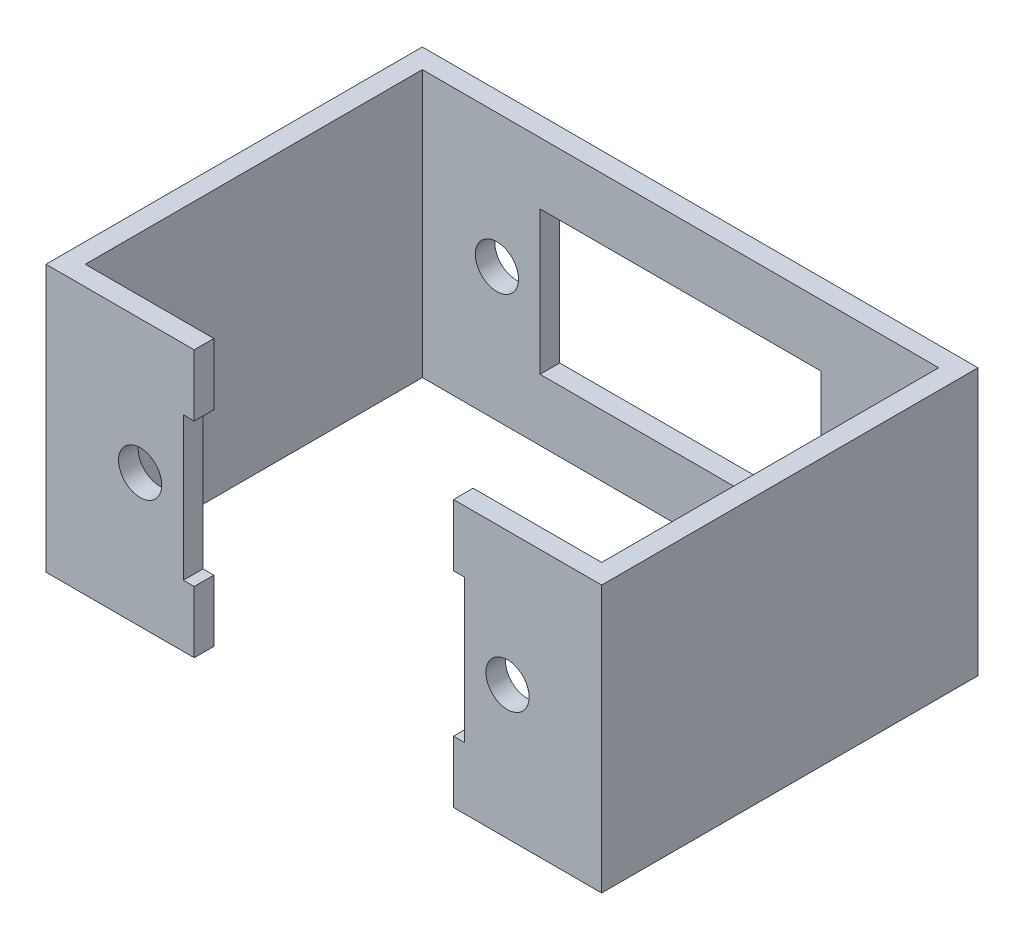
ISO-10303-21;
HEADER;
FILE_DESCRIPTION(('STEP AP214'),'2;1');
FILE_NAME('part.step','',(''),(''),'','','');
FILE_SCHEMA(('AUTOMOTIVE_DESIGN { 1 0 10303 214 1 1 1 1 }'));
ENDSEC;
DATA;
#1=APPLICATION_CONTEXT('core data for automotive mechanical design processes');
#2=APPLICATION_PROTOCOL_DEFINITION('international standard','automotive_design',2000,#1);
#3=PRODUCT_CONTEXT('',#1,'mechanical');
#4=PRODUCT('Part','Part','',(#3));
#5=PRODUCT_RELATED_PRODUCT_CATEGORY('part','',(#4));
#6=PRODUCT_DEFINITION_FORMATION('','',#4);
#7=PRODUCT_DEFINITION_CONTEXT('part definition',#1,'design');
#8=PRODUCT_DEFINITION('design','',#6,#7);
#9=PRODUCT_DEFINITION_SHAPE('','',#8);
#10=(LENGTH_UNIT() NAMED_UNIT(*) SI_UNIT(.MILLI.,.METRE.));
#11=(NAMED_UNIT(*) PLANE_ANGLE_UNIT() SI_UNIT($,.RADIAN.));
#12=(NAMED_UNIT(*) SI_UNIT($,.STERADIAN.) SOLID_ANGLE_UNIT());
#13=UNCERTAINTY_MEASURE_WITH_UNIT(LENGTH_MEASURE(1.E-05),#10,'distance_accuracy_value','');
#14=(GEOMETRIC_REPRESENTATION_CONTEXT(3) GLOBAL_UNCERTAINTY_ASSIGNED_CONTEXT((#13)) GLOBAL_UNIT_ASSIGNED_CONTEXT((#10,
#11,#12)) REPRESENTATION_CONTEXT('',''));
#15=CARTESIAN_POINT('',(0.,0.,0.));
#16=DIRECTION('',(0.,0.,1.));
#17=DIRECTION('',(1.,0.,0.));
#18=AXIS2_PLACEMENT_3D('',#15,#16,#17);
#19=CARTESIAN_POINT('',(-10.5,21.6,28.89));
#20=DIRECTION('',(-1.,0.,0.));
#21=DIRECTION('',(0.,0.,1.));
#22=AXIS2_PLACEMENT_3D('',#19,#20,#21);
#23=PLANE('',#22);
#24=DIRECTION('',(0.,-1.,0.));
#25=VECTOR('',#24,1.);
#26=CARTESIAN_POINT('',(-10.5,21.6,28.89));
#27=LINE('',#26,#25);
#28=CARTESIAN_POINT('',(-10.5,5.,28.89));
#29=VERTEX_POINT('',#28);
#30=CARTESIAN_POINT('',(-10.5,0.,28.89));
#31=VERTEX_POINT('',#30);
#32=EDGE_CURVE('E369',#29,#31,#27,.T.);
#33=ORIENTED_EDGE('',*,*,#32,.F.);
#34=DIRECTION('',(0.,0.,1.));
#35=VECTOR('',#34,1.);
#36=CARTESIAN_POINT('',(-10.5,5.,28.89));
#37=LINE('',#36,#35);
#38=CARTESIAN_POINT('',(-10.5,5.,30.48));
#39=VERTEX_POINT('',#38);
#40=EDGE_CURVE('E271',#29,#39,#37,.T.);
#41=ORIENTED_EDGE('',*,*,#40,.T.);
#42=DIRECTION('',(0.,-1.,0.));
#43=VECTOR('',#42,1.);
#44=CARTESIAN_POINT('',(-10.5,21.6,30.48));
#45=LINE('',#44,#43);
#46=CARTESIAN_POINT('',(-10.5,0.,30.48));
#47=VERTEX_POINT('',#46);
#48=EDGE_CURVE('E372',#39,#47,#45,.T.);
#49=ORIENTED_EDGE('',*,*,#48,.T.);
#50=DIRECTION('',(0.,0.,-1.));
#51=VECTOR('',#50,1.);
#52=CARTESIAN_POINT('',(-10.5,0.,28.89));
#53=LINE('',#52,#51);
#54=EDGE_CURVE('E319',#47,#31,#53,.T.);
#55=ORIENTED_EDGE('',*,*,#54,.T.);
#56=EDGE_LOOP('',(#33,#41,#49,#55));
#57=FACE_BOUND('',#56,.T.);
#58=ADVANCED_FACE('F34',(#57),#23,.F.);
#59=CARTESIAN_POINT('',(10.5,21.6,30.48));
#60=DIRECTION('',(1.,0.,0.));
#61=DIRECTION('',(0.,0.,-1.));
#62=AXIS2_PLACEMENT_3D('',#59,#60,#61);
#63=PLANE('',#62);
#64=DIRECTION('',(0.,-1.,0.));
#65=VECTOR('',#64,1.);
#66=CARTESIAN_POINT('',(10.5,21.6,30.48));
#67=LINE('',#66,#65);
#68=CARTESIAN_POINT('',(10.5,5.,30.48));
#69=VERTEX_POINT('',#68);
#70=CARTESIAN_POINT('',(10.5,0.,30.48));
#71=VERTEX_POINT('',#70);
#72=EDGE_CURVE('E349',#69,#71,#67,.T.);
#73=ORIENTED_EDGE('',*,*,#72,.F.);
#74=DIRECTION('',(0.,0.,-1.));
#75=VECTOR('',#74,1.);
#76=CARTESIAN_POINT('',(10.5,5.,30.48));
#77=LINE('',#76,#75);
#78=CARTESIAN_POINT('',(10.5,5.,28.89));
#79=VERTEX_POINT('',#78);
#80=EDGE_CURVE('E259',#69,#79,#77,.T.);
#81=ORIENTED_EDGE('',*,*,#80,.T.);
#82=DIRECTION('',(0.,-1.,0.));
#83=VECTOR('',#82,1.);
#84=CARTESIAN_POINT('',(10.5,21.6,28.89));
#85=LINE('',#84,#83);
#86=CARTESIAN_POINT('',(10.5,0.,28.89));
#87=VERTEX_POINT('',#86);
#88=EDGE_CURVE('E353',#79,#87,#85,.T.);
#89=ORIENTED_EDGE('',*,*,#88,.T.);
#90=DIRECTION('',(0.,0.,1.));
#91=VECTOR('',#90,1.);
#92=CARTESIAN_POINT('',(10.5,0.,30.48));
#93=LINE('',#92,#91);
#94=EDGE_CURVE('E333',#87,#71,#93,.T.);
#95=ORIENTED_EDGE('',*,*,#94,.T.);
#96=EDGE_LOOP('',(#73,#81,#89,#95));
#97=FACE_BOUND('',#96,.T.);
#98=ADVANCED_FACE('F432',(#97),#63,.F.);
#99=CARTESIAN_POINT('',(-22.5,21.6,30.48));
#100=DIRECTION('',(1.,0.,0.));
#101=DIRECTION('',(0.,0.,-1.));
#102=AXIS2_PLACEMENT_3D('',#99,#100,#101);
#103=PLANE('',#102);
#104=DIRECTION('',(0.,0.,1.));
#105=VECTOR('',#104,1.);
#106=CARTESIAN_POINT('',(-22.5,0.,30.48));
#107=LINE('',#106,#105);
#108=CARTESIAN_POINT('',(-22.5,0.,0.));
#109=VERTEX_POINT('',#108);
#110=CARTESIAN_POINT('',(-22.5,0.,30.48));
#111=VERTEX_POINT('',#110);
#112=EDGE_CURVE('E286',#109,#111,#107,.T.);
#113=ORIENTED_EDGE('',*,*,#112,.T.);
#114=DIRECTION('',(0.,-1.,0.));
#115=VECTOR('',#114,1.);
#116=CARTESIAN_POINT('',(-22.5,21.6,30.48));
#117=LINE('',#116,#115);
#118=CARTESIAN_POINT('',(-22.5,21.6,30.48));
#119=VERTEX_POINT('',#118);
#120=EDGE_CURVE('E11',#119,#111,#117,.T.);
#121=ORIENTED_EDGE('',*,*,#120,.F.);
#122=DIRECTION('',(0.,0.,1.));
#123=VECTOR('',#122,1.);
#124=CARTESIAN_POINT('',(-22.5,21.6,30.48));
#125=LINE('',#124,#123);
#126=CARTESIAN_POINT('',(-22.5,21.6,0.));
#127=VERTEX_POINT('',#126);
#128=EDGE_CURVE('E287',#127,#119,#125,.T.);
#129=ORIENTED_EDGE('',*,*,#128,.F.);
#130=DIRECTION('',(0.,-1.,0.));
#131=VECTOR('',#130,1.);
#132=CARTESIAN_POINT('',(-22.5,21.6,0.));
#133=LINE('',#132,#131);
#134=EDGE_CURVE('E313',#127,#109,#133,.T.);
#135=ORIENTED_EDGE('',*,*,#134,.T.);
#136=EDGE_LOOP('',(#113,#121,#129,#135));
#137=FACE_BOUND('',#136,.T.);
#138=ADVANCED_FACE('F36',(#137),#103,.F.);
#139=CARTESIAN_POINT('',(-10.5,21.6,30.48));
#140=DIRECTION('',(0.,0.,-1.));
#141=DIRECTION('',(-1.,0.,0.));
#142=AXIS2_PLACEMENT_3D('',#139,#140,#141);
#143=PLANE('',#142);
#144=CARTESIAN_POINT('',(-14.875,10.8,30.48));
#145=DIRECTION('',(0.,0.,-1.));
#146=DIRECTION('',(-1.,0.,0.));
#147=AXIS2_PLACEMENT_3D('',#144,#145,#146);
#148=CIRCLE('',#147,1.75);
#149=CARTESIAN_POINT('',(-16.625,10.8,30.48));
#150=VERTEX_POINT('',#149);
#151=EDGE_CURVE('E454',#150,#150,#148,.T.);
#152=ORIENTED_EDGE('',*,*,#151,.T.);
#153=EDGE_LOOP('',(#152));
#154=FACE_BOUND('',#153,.T.);
#155=ORIENTED_EDGE('',*,*,#48,.F.);
#156=DIRECTION('',(-1.,0.,0.));
#157=VECTOR('',#156,1.);
#158=CARTESIAN_POINT('',(-10.5,5.,30.48));
#159=LINE('',#158,#157);
#160=CARTESIAN_POINT('',(-11.375,5.,30.48));
#161=VERTEX_POINT('',#160);
#162=EDGE_CURVE('E274',#39,#161,#159,.T.);
#163=ORIENTED_EDGE('',*,*,#162,.T.);
#164=DIRECTION('',(0.,1.,0.));
#165=VECTOR('',#164,1.);
#166=CARTESIAN_POINT('',(-11.375,21.6,30.48));
#167=LINE('',#166,#165);
#168=CARTESIAN_POINT('',(-11.375,16.6,30.48));
#169=VERTEX_POINT('',#168);
#170=EDGE_CURVE('E283',#161,#169,#167,.T.);
#171=ORIENTED_EDGE('',*,*,#170,.T.);
#172=DIRECTION('',(1.,0.,0.));
#173=VECTOR('',#172,1.);
#174=CARTESIAN_POINT('',(-10.5,16.6,30.48));
#175=LINE('',#174,#173);
#176=CARTESIAN_POINT('',(-10.5,16.6,30.48));
#177=VERTEX_POINT('',#176);
#178=EDGE_CURVE('E246',#169,#177,#175,.T.);
#179=ORIENTED_EDGE('',*,*,#178,.T.);
#180=CARTESIAN_POINT('',(-10.5,21.6,30.48));
#181=VERTEX_POINT('',#180);
#182=EDGE_CURVE('E42',#181,#177,#45,.T.);
#183=ORIENTED_EDGE('',*,*,#182,.F.);
#184=DIRECTION('',(1.,0.,0.));
#185=VECTOR('',#184,1.);
#186=CARTESIAN_POINT('',(-10.5,21.6,30.48));
#187=LINE('',#186,#185);
#188=EDGE_CURVE('E290',#119,#181,#187,.T.);
#189=ORIENTED_EDGE('',*,*,#188,.F.);
#190=ORIENTED_EDGE('',*,*,#120,.T.);
#191=DIRECTION('',(1.,0.,0.));
#192=VECTOR('',#191,1.);
#193=CARTESIAN_POINT('',(-10.5,0.,30.48));
#194=LINE('',#193,#192);
#195=EDGE_CURVE('E316',#111,#47,#194,.T.);
#196=ORIENTED_EDGE('',*,*,#195,.T.);
#197=EDGE_LOOP('',(#155,#163,#171,#179,#183,#189,#190,#196));
#198=FACE_BOUND('',#197,.T.);
#199=ADVANCED_FACE('F383',(#154,#198),#143,.F.);
#200=ORIENTED_EDGE('',*,*,#182,.T.);
#201=DIRECTION('',(0.,0.,-1.));
#202=VECTOR('',#201,1.);
#203=CARTESIAN_POINT('',(-10.5,16.6,28.89));
#204=LINE('',#203,#202);
#205=CARTESIAN_POINT('',(-10.5,16.6,28.89));
#206=VERTEX_POINT('',#205);
#207=EDGE_CURVE('E243',#177,#206,#204,.T.);
#208=ORIENTED_EDGE('',*,*,#207,.T.);
#209=CARTESIAN_POINT('',(-10.5,21.6,28.89));
#210=VERTEX_POINT('',#209);
#211=EDGE_CURVE('E370',#210,#206,#27,.T.);
#212=ORIENTED_EDGE('',*,*,#211,.F.);
#213=DIRECTION('',(0.,0.,-1.));
#214=VECTOR('',#213,1.);
#215=CARTESIAN_POINT('',(-10.5,21.6,28.89));
#216=LINE('',#215,#214);
#217=EDGE_CURVE('E293',#181,#210,#216,.T.);
#218=ORIENTED_EDGE('',*,*,#217,.F.);
#219=EDGE_LOOP('',(#200,#208,#212,#218));
#220=FACE_BOUND('',#219,.T.);
#221=ADVANCED_FACE('F403',(#220),#23,.F.);
#222=CARTESIAN_POINT('',(-20.91,21.6,28.89));
#223=DIRECTION('',(0.,0.,1.));
#224=DIRECTION('',(1.,0.,0.));
#225=AXIS2_PLACEMENT_3D('',#222,#223,#224);
#226=PLANE('',#225);
#227=CARTESIAN_POINT('',(-14.875,10.8,28.89));
#228=DIRECTION('',(0.,0.,1.));
#229=DIRECTION('',(1.,0.,0.));
#230=AXIS2_PLACEMENT_3D('',#227,#228,#229);
#231=CIRCLE('',#230,1.75);
#232=CARTESIAN_POINT('',(-16.625,10.8,28.89));
#233=VERTEX_POINT('',#232);
#234=EDGE_CURVE('E457',#233,#233,#231,.T.);
#235=ORIENTED_EDGE('',*,*,#234,.T.);
#236=EDGE_LOOP('',(#235));
#237=FACE_BOUND('',#236,.T.);
#238=DIRECTION('',(0.,-1.,0.));
#239=VECTOR('',#238,1.);
#240=CARTESIAN_POINT('',(-11.375,21.6,28.89));
#241=LINE('',#240,#239);
#242=CARTESIAN_POINT('',(-11.375,16.6,28.89));
#243=VERTEX_POINT('',#242);
#244=CARTESIAN_POINT('',(-11.375,5.,28.89));
#245=VERTEX_POINT('',#244);
#246=EDGE_CURVE('E280',#243,#245,#241,.T.);
#247=ORIENTED_EDGE('',*,*,#246,.T.);
#248=DIRECTION('',(1.,0.,0.));
#249=VECTOR('',#248,1.);
#250=CARTESIAN_POINT('',(-20.91,5.,28.89));
#251=LINE('',#250,#249);
#252=EDGE_CURVE('E268',#245,#29,#251,.T.);
#253=ORIENTED_EDGE('',*,*,#252,.T.);
#254=ORIENTED_EDGE('',*,*,#32,.T.);
#255=DIRECTION('',(-1.,0.,0.));
#256=VECTOR('',#255,1.);
#257=CARTESIAN_POINT('',(-20.91,0.,28.89));
#258=LINE('',#257,#256);
#259=CARTESIAN_POINT('',(-20.91,0.,28.89));
#260=VERTEX_POINT('',#259);
#261=EDGE_CURVE('E322',#31,#260,#258,.T.);
#262=ORIENTED_EDGE('',*,*,#261,.T.);
#263=DIRECTION('',(0.,-1.,0.));
#264=VECTOR('',#263,1.);
#265=CARTESIAN_POINT('',(-20.91,21.6,28.89));
#266=LINE('',#265,#264);
#267=CARTESIAN_POINT('',(-20.91,21.6,28.89));
#268=VERTEX_POINT('',#267);
#269=EDGE_CURVE('E366',#268,#260,#266,.T.);
#270=ORIENTED_EDGE('',*,*,#269,.F.);
#271=DIRECTION('',(-1.,0.,0.));
#272=VECTOR('',#271,1.);
#273=CARTESIAN_POINT('',(-20.91,21.6,28.89));
#274=LINE('',#273,#272);
#275=EDGE_CURVE('E295',#210,#268,#274,.T.);
#276=ORIENTED_EDGE('',*,*,#275,.F.);
#277=ORIENTED_EDGE('',*,*,#211,.T.);
#278=DIRECTION('',(-1.,0.,0.));
#279=VECTOR('',#278,1.);
#280=CARTESIAN_POINT('',(-20.91,16.6,28.89));
#281=LINE('',#280,#279);
#282=EDGE_CURVE('E240',#206,#243,#281,.T.);
#283=ORIENTED_EDGE('',*,*,#282,.T.);
#284=EDGE_LOOP('',(#247,#253,#254,#262,#270,#276,#277,#283));
#285=FACE_BOUND('',#284,.T.);
#286=ADVANCED_FACE('F392',(#237,#285),#226,.F.);
#287=CARTESIAN_POINT('',(-20.91,21.6,1.59));
#288=DIRECTION('',(-1.,0.,0.));
#289=DIRECTION('',(0.,0.,1.));
#290=AXIS2_PLACEMENT_3D('',#287,#288,#289);
#291=PLANE('',#290);
#292=DIRECTION('',(0.,0.,-1.));
#293=VECTOR('',#292,1.);
#294=CARTESIAN_POINT('',(-20.91,0.,1.59));
#295=LINE('',#294,#293);
#296=CARTESIAN_POINT('',(-20.91,0.,1.59));
#297=VERTEX_POINT('',#296);
#298=EDGE_CURVE('E324',#260,#297,#295,.T.);
#299=ORIENTED_EDGE('',*,*,#298,.T.);
#300=DIRECTION('',(0.,-1.,0.));
#301=VECTOR('',#300,1.);
#302=CARTESIAN_POINT('',(-20.91,21.6,1.59));
#303=LINE('',#302,#301);
#304=CARTESIAN_POINT('',(-20.91,21.6,1.59));
#305=VERTEX_POINT('',#304);
#306=EDGE_CURVE('E363',#305,#297,#303,.T.);
#307=ORIENTED_EDGE('',*,*,#306,.F.);
#308=DIRECTION('',(0.,0.,-1.));
#309=VECTOR('',#308,1.);
#310=CARTESIAN_POINT('',(-20.91,21.6,1.59));
#311=LINE('',#310,#309);
#312=EDGE_CURVE('E297',#268,#305,#311,.T.);
#313=ORIENTED_EDGE('',*,*,#312,.F.);
#314=ORIENTED_EDGE('',*,*,#269,.T.);
#315=EDGE_LOOP('',(#299,#307,#313,#314));
#316=FACE_BOUND('',#315,.T.);
#317=ADVANCED_FACE('F396',(#316),#291,.F.);
#318=CARTESIAN_POINT('',(20.91,21.6,1.59));
#319=DIRECTION('',(0.,0.,-1.));
#320=DIRECTION('',(-1.,0.,0.));
#321=AXIS2_PLACEMENT_3D('',#318,#319,#320);
#322=PLANE('',#321);
#323=CARTESIAN_POINT('',(14.875,10.8,1.59));
#324=DIRECTION('',(0.,0.,-1.));
#325=DIRECTION('',(-1.,0.,0.));
#326=AXIS2_PLACEMENT_3D('',#323,#324,#325);
#327=CIRCLE('',#326,1.75);
#328=CARTESIAN_POINT('',(13.125,10.8,1.59));
#329=VERTEX_POINT('',#328);
#330=EDGE_CURVE('E469',#329,#329,#327,.T.);
#331=ORIENTED_EDGE('',*,*,#330,.T.);
#332=EDGE_LOOP('',(#331));
#333=FACE_BOUND('',#332,.T.);
#334=CARTESIAN_POINT('',(-14.875,10.8,1.59000000000001));
#335=DIRECTION('',(0.,0.,-1.));
#336=DIRECTION('',(-1.,0.,0.));
#337=AXIS2_PLACEMENT_3D('',#334,#335,#336);
#338=CIRCLE('',#337,1.75);
#339=CARTESIAN_POINT('',(-16.625,10.8,1.59000000000001));
#340=VERTEX_POINT('',#339);
#341=EDGE_CURVE('E463',#340,#340,#338,.T.);
#342=ORIENTED_EDGE('',*,*,#341,.T.);
#343=EDGE_LOOP('',(#342));
#344=FACE_BOUND('',#343,.T.);
#345=DIRECTION('',(-1.,0.,0.));
#346=VECTOR('',#345,1.);
#347=CARTESIAN_POINT('',(20.91,5.,1.59));
#348=LINE('',#347,#346);
#349=CARTESIAN_POINT('',(11.375,5.,1.59));
#350=VERTEX_POINT('',#349);
#351=CARTESIAN_POINT('',(-11.375,5.,1.59));
#352=VERTEX_POINT('',#351);
#353=EDGE_CURVE('E265',#350,#352,#348,.T.);
#354=ORIENTED_EDGE('',*,*,#353,.T.);
#355=DIRECTION('',(0.,1.,0.));
#356=VECTOR('',#355,1.);
#357=CARTESIAN_POINT('',(-11.375,21.6,1.59));
#358=LINE('',#357,#356);
#359=CARTESIAN_POINT('',(-11.375,16.6,1.59));
#360=VERTEX_POINT('',#359);
#361=EDGE_CURVE('E277',#352,#360,#358,.T.);
#362=ORIENTED_EDGE('',*,*,#361,.T.);
#363=DIRECTION('',(1.,0.,0.));
#364=VECTOR('',#363,1.);
#365=CARTESIAN_POINT('',(20.91,16.6,1.59));
#366=LINE('',#365,#364);
#367=CARTESIAN_POINT('',(11.375,16.6,1.59));
#368=VERTEX_POINT('',#367);
#369=EDGE_CURVE('E238',#360,#368,#366,.T.);
#370=ORIENTED_EDGE('',*,*,#369,.T.);
#371=DIRECTION('',(0.,-1.,0.));
#372=VECTOR('',#371,1.);
#373=CARTESIAN_POINT('',(11.375,21.6,1.59));
#374=LINE('',#373,#372);
#375=EDGE_CURVE('E200',#368,#350,#374,.T.);
#376=ORIENTED_EDGE('',*,*,#375,.T.);
#377=EDGE_LOOP('',(#354,#362,#370,#376));
#378=FACE_BOUND('',#377,.T.);
#379=DIRECTION('',(1.,0.,0.));
#380=VECTOR('',#379,1.);
#381=CARTESIAN_POINT('',(20.91,0.,1.59));
#382=LINE('',#381,#380);
#383=CARTESIAN_POINT('',(20.91,0.,1.59));
#384=VERTEX_POINT('',#383);
#385=EDGE_CURVE('E326',#297,#384,#382,.T.);
#386=ORIENTED_EDGE('',*,*,#385,.T.);
#387=DIRECTION('',(0.,-1.,0.));
#388=VECTOR('',#387,1.);
#389=CARTESIAN_POINT('',(20.91,21.6,1.59));
#390=LINE('',#389,#388);
#391=CARTESIAN_POINT('',(20.91,21.6,1.59));
#392=VERTEX_POINT('',#391);
#393=EDGE_CURVE('E360',#392,#384,#390,.T.);
#394=ORIENTED_EDGE('',*,*,#393,.F.);
#395=DIRECTION('',(1.,0.,0.));
#396=VECTOR('',#395,1.);
#397=CARTESIAN_POINT('',(20.91,21.6,1.59));
#398=LINE('',#397,#396);
#399=EDGE_CURVE('E299',#305,#392,#398,.T.);
#400=ORIENTED_EDGE('',*,*,#399,.F.);
#401=ORIENTED_EDGE('',*,*,#306,.T.);
#402=EDGE_LOOP('',(#386,#394,#400,#401));
#403=FACE_BOUND('',#402,.T.);
#404=ADVANCED_FACE('F474',(#333,#344,#378,#403),#322,.F.);
#405=CARTESIAN_POINT('',(20.91,21.6,28.89));
#406=DIRECTION('',(1.,0.,0.));
#407=DIRECTION('',(0.,0.,-1.));
#408=AXIS2_PLACEMENT_3D('',#405,#406,#407);
#409=PLANE('',#408);
#410=DIRECTION('',(0.,0.,1.));
#411=VECTOR('',#410,1.);
#412=CARTESIAN_POINT('',(20.91,0.,28.89));
#413=LINE('',#412,#411);
#414=CARTESIAN_POINT('',(20.91,0.,28.89));
#415=VERTEX_POINT('',#414);
#416=EDGE_CURVE('E328',#384,#415,#413,.T.);
#417=ORIENTED_EDGE('',*,*,#416,.T.);
#418=DIRECTION('',(0.,-1.,0.));
#419=VECTOR('',#418,1.);
#420=CARTESIAN_POINT('',(20.91,21.6,28.89));
#421=LINE('',#420,#419);
#422=CARTESIAN_POINT('',(20.91,21.6,28.89));
#423=VERTEX_POINT('',#422);
#424=EDGE_CURVE('E357',#423,#415,#421,.T.);
#425=ORIENTED_EDGE('',*,*,#424,.F.);
#426=DIRECTION('',(0.,0.,1.));
#427=VECTOR('',#426,1.);
#428=CARTESIAN_POINT('',(20.91,21.6,28.89));
#429=LINE('',#428,#427);
#430=EDGE_CURVE('E301',#392,#423,#429,.T.);
#431=ORIENTED_EDGE('',*,*,#430,.F.);
#432=ORIENTED_EDGE('',*,*,#393,.T.);
#433=EDGE_LOOP('',(#417,#425,#431,#432));
#434=FACE_BOUND('',#433,.T.);
#435=ADVANCED_FACE('F477',(#434),#409,.F.);
#436=CARTESIAN_POINT('',(10.5,21.6,28.89));
#437=DIRECTION('',(0.,0.,1.));
#438=DIRECTION('',(1.,0.,0.));
#439=AXIS2_PLACEMENT_3D('',#436,#437,#438);
#440=PLANE('',#439);
#441=CARTESIAN_POINT('',(14.875,10.8,28.89));
#442=DIRECTION('',(0.,0.,1.));
#443=DIRECTION('',(1.,0.,0.));
#444=AXIS2_PLACEMENT_3D('',#441,#442,#443);
#445=CIRCLE('',#444,1.75);
#446=CARTESIAN_POINT('',(13.125,10.8,28.89));
#447=VERTEX_POINT('',#446);
#448=EDGE_CURVE('E460',#447,#447,#445,.T.);
#449=ORIENTED_EDGE('',*,*,#448,.T.);
#450=EDGE_LOOP('',(#449));
#451=FACE_BOUND('',#450,.T.);
#452=ORIENTED_EDGE('',*,*,#88,.F.);
#453=DIRECTION('',(1.,0.,0.));
#454=VECTOR('',#453,1.);
#455=CARTESIAN_POINT('',(10.5,5.,28.89));
#456=LINE('',#455,#454);
#457=CARTESIAN_POINT('',(11.375,5.,28.89));
#458=VERTEX_POINT('',#457);
#459=EDGE_CURVE('E262',#79,#458,#456,.T.);
#460=ORIENTED_EDGE('',*,*,#459,.T.);
#461=DIRECTION('',(0.,1.,0.));
#462=VECTOR('',#461,1.);
#463=CARTESIAN_POINT('',(11.375,21.6,28.89));
#464=LINE('',#463,#462);
#465=CARTESIAN_POINT('',(11.375,16.6,28.89));
#466=VERTEX_POINT('',#465);
#467=EDGE_CURVE('E252',#458,#466,#464,.T.);
#468=ORIENTED_EDGE('',*,*,#467,.T.);
#469=DIRECTION('',(-1.,0.,0.));
#470=VECTOR('',#469,1.);
#471=CARTESIAN_POINT('',(10.5,16.6,28.89));
#472=LINE('',#471,#470);
#473=CARTESIAN_POINT('',(10.5,16.6,28.89));
#474=VERTEX_POINT('',#473);
#475=EDGE_CURVE('E235',#466,#474,#472,.T.);
#476=ORIENTED_EDGE('',*,*,#475,.T.);
#477=CARTESIAN_POINT('',(10.5,21.6,28.89));
#478=VERTEX_POINT('',#477);
#479=EDGE_CURVE('E354',#478,#474,#85,.T.);
#480=ORIENTED_EDGE('',*,*,#479,.F.);
#481=DIRECTION('',(-1.,0.,0.));
#482=VECTOR('',#481,1.);
#483=CARTESIAN_POINT('',(10.5,21.6,28.89));
#484=LINE('',#483,#482);
#485=EDGE_CURVE('E303',#423,#478,#484,.T.);
#486=ORIENTED_EDGE('',*,*,#485,.F.);
#487=ORIENTED_EDGE('',*,*,#424,.T.);
#488=DIRECTION('',(-1.,0.,0.));
#489=VECTOR('',#488,1.);
#490=CARTESIAN_POINT('',(10.5,0.,28.89));
#491=LINE('',#490,#489);
#492=EDGE_CURVE('E330',#415,#87,#491,.T.);
#493=ORIENTED_EDGE('',*,*,#492,.T.);
#494=EDGE_LOOP('',(#452,#460,#468,#476,#480,#486,#487,#493));
#495=FACE_BOUND('',#494,.T.);
#496=ADVANCED_FACE('F489',(#451,#495),#440,.F.);
#497=ORIENTED_EDGE('',*,*,#479,.T.);
#498=DIRECTION('',(0.,0.,1.));
#499=VECTOR('',#498,1.);
#500=CARTESIAN_POINT('',(10.5,16.6,30.48));
#501=LINE('',#500,#499);
#502=CARTESIAN_POINT('',(10.5,16.6,30.48));
#503=VERTEX_POINT('',#502);
#504=EDGE_CURVE('E232',#474,#503,#501,.T.);
#505=ORIENTED_EDGE('',*,*,#504,.T.);
#506=CARTESIAN_POINT('',(10.5,21.6,30.48));
#507=VERTEX_POINT('',#506);
#508=EDGE_CURVE('E350',#507,#503,#67,.T.);
#509=ORIENTED_EDGE('',*,*,#508,.F.);
#510=DIRECTION('',(0.,0.,1.));
#511=VECTOR('',#510,1.);
#512=CARTESIAN_POINT('',(10.5,21.6,30.48));
#513=LINE('',#512,#511);
#514=EDGE_CURVE('E305',#478,#507,#513,.T.);
#515=ORIENTED_EDGE('',*,*,#514,.F.);
#516=EDGE_LOOP('',(#497,#505,#509,#515));
#517=FACE_BOUND('',#516,.T.);
#518=ADVANCED_FACE('F439',(#517),#63,.F.);
#519=CARTESIAN_POINT('',(22.5,21.6,30.48));
#520=DIRECTION('',(0.,0.,-1.));
#521=DIRECTION('',(-1.,0.,0.));
#522=AXIS2_PLACEMENT_3D('',#519,#520,#521);
#523=PLANE('',#522);
#524=CARTESIAN_POINT('',(14.875,10.8,30.48));
#525=DIRECTION('',(0.,0.,-1.));
#526=DIRECTION('',(-1.,0.,0.));
#527=AXIS2_PLACEMENT_3D('',#524,#525,#526);
#528=CIRCLE('',#527,1.75);
#529=CARTESIAN_POINT('',(13.125,10.8,30.48));
#530=VERTEX_POINT('',#529);
#531=EDGE_CURVE('E456',#530,#530,#528,.T.);
#532=ORIENTED_EDGE('',*,*,#531,.T.);
#533=EDGE_LOOP('',(#532));
#534=FACE_BOUND('',#533,.T.);
#535=DIRECTION('',(0.,-1.,0.));
#536=VECTOR('',#535,1.);
#537=CARTESIAN_POINT('',(11.375,21.6,30.48));
#538=LINE('',#537,#536);
#539=CARTESIAN_POINT('',(11.375,16.6,30.48));
#540=VERTEX_POINT('',#539);
#541=CARTESIAN_POINT('',(11.375,5.,30.48));
#542=VERTEX_POINT('',#541);
#543=EDGE_CURVE('E249',#540,#542,#538,.T.);
#544=ORIENTED_EDGE('',*,*,#543,.T.);
#545=DIRECTION('',(-1.,0.,0.));
#546=VECTOR('',#545,1.);
#547=CARTESIAN_POINT('',(22.5,5.,30.48));
#548=LINE('',#547,#546);
#549=EDGE_CURVE('E256',#542,#69,#548,.T.);
#550=ORIENTED_EDGE('',*,*,#549,.T.);
#551=ORIENTED_EDGE('',*,*,#72,.T.);
#552=DIRECTION('',(1.,0.,0.));
#553=VECTOR('',#552,1.);
#554=CARTESIAN_POINT('',(22.5,0.,30.48));
#555=LINE('',#554,#553);
#556=CARTESIAN_POINT('',(22.5,0.,30.48));
#557=VERTEX_POINT('',#556);
#558=EDGE_CURVE('E336',#71,#557,#555,.T.);
#559=ORIENTED_EDGE('',*,*,#558,.T.);
#560=DIRECTION('',(0.,-1.,0.));
#561=VECTOR('',#560,1.);
#562=CARTESIAN_POINT('',(22.5,21.6,30.48));
#563=LINE('',#562,#561);
#564=CARTESIAN_POINT('',(22.5,21.6,30.48));
#565=VERTEX_POINT('',#564);
#566=EDGE_CURVE('E346',#565,#557,#563,.T.);
#567=ORIENTED_EDGE('',*,*,#566,.F.);
#568=DIRECTION('',(1.,0.,0.));
#569=VECTOR('',#568,1.);
#570=CARTESIAN_POINT('',(22.5,21.6,30.48));
#571=LINE('',#570,#569);
#572=EDGE_CURVE('E307',#507,#565,#571,.T.);
#573=ORIENTED_EDGE('',*,*,#572,.F.);
#574=ORIENTED_EDGE('',*,*,#508,.T.);
#575=DIRECTION('',(1.,0.,0.));
#576=VECTOR('',#575,1.);
#577=CARTESIAN_POINT('',(22.5,16.6,30.48));
#578=LINE('',#577,#576);
#579=EDGE_CURVE('E229',#503,#540,#578,.T.);
#580=ORIENTED_EDGE('',*,*,#579,.T.);
#581=EDGE_LOOP('',(#544,#550,#551,#559,#567,#573,#574,#580));
#582=FACE_BOUND('',#581,.T.);
#583=ADVANCED_FACE('F498',(#534,#582),#523,.F.);
#584=CARTESIAN_POINT('',(22.5,21.6,0.));
#585=DIRECTION('',(-1.,0.,0.));
#586=DIRECTION('',(0.,0.,1.));
#587=AXIS2_PLACEMENT_3D('',#584,#585,#586);
#588=PLANE('',#587);
#589=DIRECTION('',(0.,0.,-1.));
#590=VECTOR('',#589,1.);
#591=CARTESIAN_POINT('',(22.5,0.,0.));
#592=LINE('',#591,#590);
#593=CARTESIAN_POINT('',(22.5,0.,0.));
#594=VERTEX_POINT('',#593);
#595=EDGE_CURVE('E338',#557,#594,#592,.T.);
#596=ORIENTED_EDGE('',*,*,#595,.T.);
#597=DIRECTION('',(0.,-1.,0.));
#598=VECTOR('',#597,1.);
#599=CARTESIAN_POINT('',(22.5,21.6,0.));
#600=LINE('',#599,#598);
#601=CARTESIAN_POINT('',(22.5,21.6,0.));
#602=VERTEX_POINT('',#601);
#603=EDGE_CURVE('E343',#602,#594,#600,.T.);
#604=ORIENTED_EDGE('',*,*,#603,.F.);
#605=DIRECTION('',(0.,0.,-1.));
#606=VECTOR('',#605,1.);
#607=CARTESIAN_POINT('',(22.5,21.6,0.));
#608=LINE('',#607,#606);
#609=EDGE_CURVE('E309',#565,#602,#608,.T.);
#610=ORIENTED_EDGE('',*,*,#609,.F.);
#611=ORIENTED_EDGE('',*,*,#566,.T.);
#612=EDGE_LOOP('',(#596,#604,#610,#611));
#613=FACE_BOUND('',#612,.T.);
#614=ADVANCED_FACE('F503',(#613),#588,.F.);
#615=CARTESIAN_POINT('',(-22.5,21.6,0.));
#616=DIRECTION('',(0.,0.,1.));
#617=DIRECTION('',(1.,0.,0.));
#618=AXIS2_PLACEMENT_3D('',#615,#616,#617);
#619=PLANE('',#618);
#620=CARTESIAN_POINT('',(14.875,10.8,0.));
#621=DIRECTION('',(0.,0.,-1.));
#622=DIRECTION('',(-1.,0.,0.));
#623=AXIS2_PLACEMENT_3D('',#620,#621,#622);
#624=CIRCLE('',#623,1.75);
#625=CARTESIAN_POINT('',(13.125,10.8,0.));
#626=VERTEX_POINT('',#625);
#627=EDGE_CURVE('E716',#626,#626,#624,.T.);
#628=ORIENTED_EDGE('',*,*,#627,.F.);
#629=EDGE_LOOP('',(#628));
#630=FACE_BOUND('',#629,.T.);
#631=CARTESIAN_POINT('',(-14.875,10.8,0.));
#632=DIRECTION('',(0.,0.,-1.));
#633=DIRECTION('',(-1.,0.,0.));
#634=AXIS2_PLACEMENT_3D('',#631,#632,#633);
#635=CIRCLE('',#634,1.75);
#636=CARTESIAN_POINT('',(-16.625,10.8,0.));
#637=VERTEX_POINT('',#636);
#638=EDGE_CURVE('E722',#637,#637,#635,.T.);
#639=ORIENTED_EDGE('',*,*,#638,.F.);
#640=EDGE_LOOP('',(#639));
#641=FACE_BOUND('',#640,.T.);
#642=DIRECTION('',(1.,0.,0.));
#643=VECTOR('',#642,1.);
#644=CARTESIAN_POINT('',(11.375,16.6,0.));
#645=LINE('',#644,#643);
#646=CARTESIAN_POINT('',(-11.375,16.6,0.));
#647=VERTEX_POINT('',#646);
#648=CARTESIAN_POINT('',(11.375,16.6,0.));
#649=VERTEX_POINT('',#648);
#650=EDGE_CURVE('E206',#647,#649,#645,.T.);
#651=ORIENTED_EDGE('',*,*,#650,.F.);
#652=DIRECTION('',(0.,1.,0.));
#653=VECTOR('',#652,1.);
#654=CARTESIAN_POINT('',(-11.375,16.6,0.));
#655=LINE('',#654,#653);
#656=CARTESIAN_POINT('',(-11.375,5.,0.));
#657=VERTEX_POINT('',#656);
#658=EDGE_CURVE('E212',#657,#647,#655,.T.);
#659=ORIENTED_EDGE('',*,*,#658,.F.);
#660=DIRECTION('',(-1.,0.,0.));
#661=VECTOR('',#660,1.);
#662=CARTESIAN_POINT('',(11.375,5.,0.));
#663=LINE('',#662,#661);
#664=CARTESIAN_POINT('',(11.375,5.,0.));
#665=VERTEX_POINT('',#664);
#666=EDGE_CURVE('E217',#665,#657,#663,.T.);
#667=ORIENTED_EDGE('',*,*,#666,.F.);
#668=DIRECTION('',(0.,-1.,0.));
#669=VECTOR('',#668,1.);
#670=CARTESIAN_POINT('',(11.375,16.6,0.));
#671=LINE('',#670,#669);
#672=EDGE_CURVE('E197',#649,#665,#671,.T.);
#673=ORIENTED_EDGE('',*,*,#672,.F.);
#674=EDGE_LOOP('',(#651,#659,#667,#673));
#675=FACE_BOUND('',#674,.T.);
#676=DIRECTION('',(-1.,0.,0.));
#677=VECTOR('',#676,1.);
#678=CARTESIAN_POINT('',(-22.5,0.,0.));
#679=LINE('',#678,#677);
#680=EDGE_CURVE('E291',#594,#109,#679,.T.);
#681=ORIENTED_EDGE('',*,*,#680,.T.);
#682=ORIENTED_EDGE('',*,*,#134,.F.);
#683=DIRECTION('',(-1.,0.,0.));
#684=VECTOR('',#683,1.);
#685=CARTESIAN_POINT('',(-22.5,21.6,0.));
#686=LINE('',#685,#684);
#687=EDGE_CURVE('E311',#602,#127,#686,.T.);
#688=ORIENTED_EDGE('',*,*,#687,.F.);
#689=ORIENTED_EDGE('',*,*,#603,.T.);
#690=EDGE_LOOP('',(#681,#682,#688,#689));
#691=FACE_BOUND('',#690,.T.);
#692=ADVANCED_FACE('F214',(#630,#641,#675,#691),#619,.F.);
#693=CARTESIAN_POINT('',(0.,21.6,0.));
#694=DIRECTION('',(0.,-1.,0.));
#695=DIRECTION('',(0.,0.,-1.));
#696=AXIS2_PLACEMENT_3D('',#693,#694,#695);
#697=PLANE('',#696);
#698=ORIENTED_EDGE('',*,*,#128,.T.);
#699=ORIENTED_EDGE('',*,*,#188,.T.);
#700=ORIENTED_EDGE('',*,*,#217,.T.);
#701=ORIENTED_EDGE('',*,*,#275,.T.);
#702=ORIENTED_EDGE('',*,*,#312,.T.);
#703=ORIENTED_EDGE('',*,*,#399,.T.);
#704=ORIENTED_EDGE('',*,*,#430,.T.);
#705=ORIENTED_EDGE('',*,*,#485,.T.);
#706=ORIENTED_EDGE('',*,*,#514,.T.);
#707=ORIENTED_EDGE('',*,*,#572,.T.);
#708=ORIENTED_EDGE('',*,*,#609,.T.);
#709=ORIENTED_EDGE('',*,*,#687,.T.);
#710=EDGE_LOOP('',(#698,#699,#700,#701,#702,#703,#704,#705,#706,#707,#708,#709));
#711=FACE_BOUND('',#710,.T.);
#712=ADVANCED_FACE('F400',(#711),#697,.F.);
#713=CARTESIAN_POINT('',(0.,0.,0.));
#714=DIRECTION('',(0.,-1.,0.));
#715=DIRECTION('',(0.,0.,-1.));
#716=AXIS2_PLACEMENT_3D('',#713,#714,#715);
#717=PLANE('',#716);
#718=ORIENTED_EDGE('',*,*,#112,.F.);
#719=ORIENTED_EDGE('',*,*,#680,.F.);
#720=ORIENTED_EDGE('',*,*,#595,.F.);
#721=ORIENTED_EDGE('',*,*,#558,.F.);
#722=ORIENTED_EDGE('',*,*,#94,.F.);
#723=ORIENTED_EDGE('',*,*,#492,.F.);
#724=ORIENTED_EDGE('',*,*,#416,.F.);
#725=ORIENTED_EDGE('',*,*,#385,.F.);
#726=ORIENTED_EDGE('',*,*,#298,.F.);
#727=ORIENTED_EDGE('',*,*,#261,.F.);
#728=ORIENTED_EDGE('',*,*,#54,.F.);
#729=ORIENTED_EDGE('',*,*,#195,.F.);
#730=EDGE_LOOP('',(#718,#719,#720,#721,#722,#723,#724,#725,#726,#727,#728,#729));
#731=FACE_BOUND('',#730,.T.);
#732=ADVANCED_FACE('F387',(#731),#717,.T.);
#733=CARTESIAN_POINT('',(11.375,16.6,50.));
#734=DIRECTION('',(0.,1.,0.));
#735=DIRECTION('',(-1.,0.,0.));
#736=AXIS2_PLACEMENT_3D('',#733,#734,#735);
#737=PLANE('',#736);
#738=DIRECTION('',(0.,0.,-1.));
#739=VECTOR('',#738,1.);
#740=CARTESIAN_POINT('',(-11.375,16.6,50.));
#741=LINE('',#740,#739);
#742=EDGE_CURVE('E209',#360,#647,#741,.T.);
#743=ORIENTED_EDGE('',*,*,#742,.T.);
#744=ORIENTED_EDGE('',*,*,#650,.T.);
#745=DIRECTION('',(0.,0.,-1.));
#746=VECTOR('',#745,1.);
#747=CARTESIAN_POINT('',(11.375,16.6,50.));
#748=LINE('',#747,#746);
#749=EDGE_CURVE('E57',#368,#649,#748,.T.);
#750=ORIENTED_EDGE('',*,*,#749,.F.);
#751=ORIENTED_EDGE('',*,*,#369,.F.);
#752=EDGE_LOOP('',(#743,#744,#750,#751));
#753=FACE_BOUND('',#752,.T.);
#754=ADVANCED_FACE('F207',(#753),#737,.F.);
#755=CARTESIAN_POINT('',(11.375,16.6,50.));
#756=DIRECTION('',(1.,0.,0.));
#757=DIRECTION('',(0.,0.,-1.));
#758=AXIS2_PLACEMENT_3D('',#755,#756,#757);
#759=PLANE('',#758);
#760=ORIENTED_EDGE('',*,*,#749,.T.);
#761=ORIENTED_EDGE('',*,*,#672,.T.);
#762=DIRECTION('',(0.,0.,-1.));
#763=VECTOR('',#762,1.);
#764=CARTESIAN_POINT('',(11.375,5.,50.));
#765=LINE('',#764,#763);
#766=EDGE_CURVE('E226',#350,#665,#765,.T.);
#767=ORIENTED_EDGE('',*,*,#766,.F.);
#768=ORIENTED_EDGE('',*,*,#375,.F.);
#769=EDGE_LOOP('',(#760,#761,#767,#768));
#770=FACE_BOUND('',#769,.T.);
#771=ADVANCED_FACE('F194',(#770),#759,.F.);
#772=CARTESIAN_POINT('',(11.375,5.,50.));
#773=DIRECTION('',(0.,-1.,0.));
#774=DIRECTION('',(0.,0.,-1.));
#775=AXIS2_PLACEMENT_3D('',#772,#773,#774);
#776=PLANE('',#775);
#777=ORIENTED_EDGE('',*,*,#766,.T.);
#778=ORIENTED_EDGE('',*,*,#666,.T.);
#779=DIRECTION('',(0.,0.,-1.));
#780=VECTOR('',#779,1.);
#781=CARTESIAN_POINT('',(-11.375,5.,50.));
#782=LINE('',#781,#780);
#783=EDGE_CURVE('E222',#352,#657,#782,.T.);
#784=ORIENTED_EDGE('',*,*,#783,.F.);
#785=ORIENTED_EDGE('',*,*,#353,.F.);
#786=EDGE_LOOP('',(#777,#778,#784,#785));
#787=FACE_BOUND('',#786,.T.);
#788=ADVANCED_FACE('F413',(#787),#776,.F.);
#789=CARTESIAN_POINT('',(-11.375,16.6,50.));
#790=DIRECTION('',(-1.,0.,0.));
#791=DIRECTION('',(0.,0.,1.));
#792=AXIS2_PLACEMENT_3D('',#789,#790,#791);
#793=PLANE('',#792);
#794=ORIENTED_EDGE('',*,*,#783,.T.);
#795=ORIENTED_EDGE('',*,*,#658,.T.);
#796=ORIENTED_EDGE('',*,*,#742,.F.);
#797=ORIENTED_EDGE('',*,*,#361,.F.);
#798=EDGE_LOOP('',(#794,#795,#796,#797));
#799=FACE_BOUND('',#798,.T.);
#800=ADVANCED_FACE('F423',(#799),#793,.F.);
#801=EDGE_CURVE('E202',#540,#466,#748,.T.);
#802=ORIENTED_EDGE('',*,*,#801,.F.);
#803=ORIENTED_EDGE('',*,*,#579,.F.);
#804=ORIENTED_EDGE('',*,*,#504,.F.);
#805=ORIENTED_EDGE('',*,*,#475,.F.);
#806=EDGE_LOOP('',(#802,#803,#804,#805));
#807=FACE_BOUND('',#806,.T.);
#808=ADVANCED_FACE('F421',(#807),#737,.F.);
#809=EDGE_CURVE('E225',#542,#458,#765,.T.);
#810=ORIENTED_EDGE('',*,*,#809,.F.);
#811=ORIENTED_EDGE('',*,*,#543,.F.);
#812=ORIENTED_EDGE('',*,*,#801,.T.);
#813=ORIENTED_EDGE('',*,*,#467,.F.);
#814=EDGE_LOOP('',(#810,#811,#812,#813));
#815=FACE_BOUND('',#814,.T.);
#816=ADVANCED_FACE('F429',(#815),#759,.F.);
#817=ORIENTED_EDGE('',*,*,#80,.F.);
#818=ORIENTED_EDGE('',*,*,#549,.F.);
#819=ORIENTED_EDGE('',*,*,#809,.T.);
#820=ORIENTED_EDGE('',*,*,#459,.F.);
#821=EDGE_LOOP('',(#817,#818,#819,#820));
#822=FACE_BOUND('',#821,.T.);
#823=ADVANCED_FACE('F414',(#822),#776,.F.);
#824=EDGE_CURVE('E224',#161,#245,#782,.T.);
#825=ORIENTED_EDGE('',*,*,#824,.T.);
#826=ORIENTED_EDGE('',*,*,#246,.F.);
#827=EDGE_CURVE('E49',#169,#243,#741,.T.);
#828=ORIENTED_EDGE('',*,*,#827,.F.);
#829=ORIENTED_EDGE('',*,*,#170,.F.);
#830=EDGE_LOOP('',(#825,#826,#828,#829));
#831=FACE_BOUND('',#830,.T.);
#832=ADVANCED_FACE('F408',(#831),#793,.F.);
#833=ORIENTED_EDGE('',*,*,#40,.F.);
#834=ORIENTED_EDGE('',*,*,#252,.F.);
#835=ORIENTED_EDGE('',*,*,#824,.F.);
#836=ORIENTED_EDGE('',*,*,#162,.F.);
#837=EDGE_LOOP('',(#833,#834,#835,#836));
#838=FACE_BOUND('',#837,.T.);
#839=ADVANCED_FACE('F410',(#838),#776,.F.);
#840=ORIENTED_EDGE('',*,*,#827,.T.);
#841=ORIENTED_EDGE('',*,*,#282,.F.);
#842=ORIENTED_EDGE('',*,*,#207,.F.);
#843=ORIENTED_EDGE('',*,*,#178,.F.);
#844=EDGE_LOOP('',(#840,#841,#842,#843));
#845=FACE_BOUND('',#844,.T.);
#846=ADVANCED_FACE('F404',(#845),#737,.F.);
#847=CARTESIAN_POINT('',(-14.875,10.8,50.));
#848=DIRECTION('',(0.,0.,-1.));
#849=DIRECTION('',(-1.,0.,0.));
#850=AXIS2_PLACEMENT_3D('',#847,#848,#849);
#851=CYLINDRICAL_SURFACE('',#850,1.75);
#852=ORIENTED_EDGE('',*,*,#638,.T.);
#853=EDGE_LOOP('',(#852));
#854=FACE_BOUND('',#853,.T.);
#855=ORIENTED_EDGE('',*,*,#341,.F.);
#856=EDGE_LOOP('',(#855));
#857=FACE_BOUND('',#856,.T.);
#858=ADVANCED_FACE('F419',(#854,#857),#851,.F.);
#859=CARTESIAN_POINT('',(14.875,10.8,50.));
#860=DIRECTION('',(0.,0.,-1.));
#861=DIRECTION('',(-1.,0.,0.));
#862=AXIS2_PLACEMENT_3D('',#859,#860,#861);
#863=CYLINDRICAL_SURFACE('',#862,1.75);
#864=ORIENTED_EDGE('',*,*,#627,.T.);
#865=EDGE_LOOP('',(#864));
#866=FACE_BOUND('',#865,.T.);
#867=ORIENTED_EDGE('',*,*,#330,.F.);
#868=EDGE_LOOP('',(#867));
#869=FACE_BOUND('',#868,.T.);
#870=ADVANCED_FACE('F679',(#866,#869),#863,.F.);
#871=CARTESIAN_POINT('',(13.125,10.8,30.48));
#872=CARTESIAN_POINT('',(13.125,10.8,30.4634375));
#873=CARTESIAN_POINT('',(13.125,10.8,30.446875));
#874=CARTESIAN_POINT('',(13.125,10.8,30.41375));
#875=CARTESIAN_POINT('',(13.125,10.8,30.3971875));
#876=CARTESIAN_POINT('',(13.125,10.8,30.3640625));
#877=CARTESIAN_POINT('',(13.125,10.8,30.3475));
#878=CARTESIAN_POINT('',(13.125,10.8,30.314375));
#879=CARTESIAN_POINT('',(13.125,10.8,30.2978125));
#880=CARTESIAN_POINT('',(13.125,10.8,30.2646875));
#881=CARTESIAN_POINT('',(13.125,10.8,30.248125));
#882=CARTESIAN_POINT('',(13.125,10.8,30.215));
#883=CARTESIAN_POINT('',(13.125,10.8,30.1984375));
#884=CARTESIAN_POINT('',(13.125,10.8,30.1653125));
#885=CARTESIAN_POINT('',(13.125,10.8,30.14875));
#886=CARTESIAN_POINT('',(13.125,10.8,30.115625));
#887=CARTESIAN_POINT('',(13.125,10.8,30.0990625));
#888=CARTESIAN_POINT('',(13.125,10.8,30.0659375));
#889=CARTESIAN_POINT('',(13.125,10.8,30.049375));
#890=CARTESIAN_POINT('',(13.125,10.8,30.01625));
#891=CARTESIAN_POINT('',(13.125,10.8,29.9996875));
#892=CARTESIAN_POINT('',(13.125,10.8,29.9665625));
#893=CARTESIAN_POINT('',(13.125,10.8,29.95));
#894=CARTESIAN_POINT('',(13.125,10.8,29.916875));
#895=CARTESIAN_POINT('',(13.125,10.8,29.9003125));
#896=CARTESIAN_POINT('',(13.125,10.8,29.8671875));
#897=CARTESIAN_POINT('',(13.125,10.8,29.850625));
#898=CARTESIAN_POINT('',(13.125,10.8,29.8175));
#899=CARTESIAN_POINT('',(13.125,10.8,29.8009375));
#900=CARTESIAN_POINT('',(13.125,10.8,29.7678125));
#901=CARTESIAN_POINT('',(13.125,10.8,29.75125));
#902=CARTESIAN_POINT('',(13.125,10.8,29.718125));
#903=CARTESIAN_POINT('',(13.125,10.8,29.7015625));
#904=CARTESIAN_POINT('',(13.125,10.8,29.6684375));
#905=CARTESIAN_POINT('',(13.125,10.8,29.651875));
#906=CARTESIAN_POINT('',(13.125,10.8,29.61875));
#907=CARTESIAN_POINT('',(13.125,10.8,29.6021875));
#908=CARTESIAN_POINT('',(13.125,10.8,29.5690625));
#909=CARTESIAN_POINT('',(13.125,10.8,29.5525));
#910=CARTESIAN_POINT('',(13.125,10.8,29.519375));
#911=CARTESIAN_POINT('',(13.125,10.8,29.5028125));
#912=CARTESIAN_POINT('',(13.125,10.8,29.4696875));
#913=CARTESIAN_POINT('',(13.125,10.8,29.453125));
#914=CARTESIAN_POINT('',(13.125,10.8,29.42));
#915=CARTESIAN_POINT('',(13.125,10.8,29.4034375));
#916=CARTESIAN_POINT('',(13.125,10.8,29.3703125));
#917=CARTESIAN_POINT('',(13.125,10.8,29.35375));
#918=CARTESIAN_POINT('',(13.125,10.8,29.320625));
#919=CARTESIAN_POINT('',(13.125,10.8,29.3040625));
#920=CARTESIAN_POINT('',(13.125,10.8,29.2709375));
#921=CARTESIAN_POINT('',(13.125,10.8,29.254375));
#922=CARTESIAN_POINT('',(13.125,10.8,29.22125));
#923=CARTESIAN_POINT('',(13.125,10.8,29.2046875));
#924=CARTESIAN_POINT('',(13.125,10.8,29.1715625));
#925=CARTESIAN_POINT('',(13.125,10.8,29.155));
#926=CARTESIAN_POINT('',(13.125,10.8,29.121875));
#927=CARTESIAN_POINT('',(13.125,10.8,29.1053125));
#928=CARTESIAN_POINT('',(13.125,10.8,29.0721875));
#929=CARTESIAN_POINT('',(13.125,10.8,29.055625));
#930=CARTESIAN_POINT('',(13.125,10.8,29.0225));
#931=CARTESIAN_POINT('',(13.125,10.8,29.0059375));
#932=CARTESIAN_POINT('',(13.125,10.8,28.9728125));
#933=CARTESIAN_POINT('',(13.125,10.8,28.95625));
#934=CARTESIAN_POINT('',(13.125,10.8,28.923125));
#935=CARTESIAN_POINT('',(13.125,10.8,28.9065625));
#936=CARTESIAN_POINT('',(13.125,10.8,28.89));
#937=B_SPLINE_CURVE_WITH_KNOTS('',3,(#871,#872,#873,#874,#875,#876,#877,#878,#879,#880,#881,
#882,#883,#884,#885,#886,#887,#888,#889,#890,#891,#892,#893,#894,#895,#896,#897,#898,#899,#900,
#901,#902,#903,#904,#905,#906,#907,#908,#909,#910,#911,#912,#913,#914,#915,#916,#917,#918,#919,
#920,#921,#922,#923,#924,#925,#926,#927,#928,#929,#930,#931,#932,#933,#934,#935,#936),
.UNSPECIFIED.,.F.,.F.,(4,2,2,2,2,2,2,2,2,2,2,2,2,2,2,2,2,2,2,2,2,2,2,2,2,2,2,2,2,2,2,2,4),(0.,
0.0496874999999994,0.0993749999999988,0.149062500000002,0.198750000000001,0.2484375,0.298125,
0.347812499999999,0.397500000000002,0.447187500000001,0.496875000000001,0.5465625,0.59625,
0.645937499999999,0.695625000000002,0.745312500000001,0.795000000000001,0.8446875,
0.894374999999999,0.944062500000002,0.993750000000002,1.0434375,1.093125,1.1428125,1.1925,
1.2421875,1.291875,1.3415625,1.39125,1.4409375,1.490625,1.5403125,1.59),.UNSPECIFIED.);
#938=EDGE_CURVE('BSEAM688',#530,#447,#937,.T.);
#939=ORIENTED_EDGE('',*,*,#531,.F.);
#940=ORIENTED_EDGE('',*,*,#448,.F.);
#941=ORIENTED_EDGE('',*,*,#938,.T.);
#942=ORIENTED_EDGE('',*,*,#938,.F.);
#943=EDGE_LOOP('',(#939,#941,#940,#942));
#944=FACE_BOUND('',#943,.T.);
#945=ADVANCED_FACE('F688',(#944),#863,.F.);
#946=CARTESIAN_POINT('',(-16.625,10.8,28.89));
#947=CARTESIAN_POINT('',(-16.625,10.8,28.9065625));
#948=CARTESIAN_POINT('',(-16.625,10.8,28.923125));
#949=CARTESIAN_POINT('',(-16.625,10.8,28.95625));
#950=CARTESIAN_POINT('',(-16.625,10.8,28.9728125));
#951=CARTESIAN_POINT('',(-16.625,10.8,29.0059375));
#952=CARTESIAN_POINT('',(-16.625,10.8,29.0225));
#953=CARTESIAN_POINT('',(-16.625,10.8,29.055625));
#954=CARTESIAN_POINT('',(-16.625,10.8,29.0721875));
#955=CARTESIAN_POINT('',(-16.625,10.8,29.1053125));
#956=CARTESIAN_POINT('',(-16.625,10.8,29.121875));
#957=CARTESIAN_POINT('',(-16.625,10.8,29.155));
#958=CARTESIAN_POINT('',(-16.625,10.8,29.1715625));
#959=CARTESIAN_POINT('',(-16.625,10.8,29.2046875));
#960=CARTESIAN_POINT('',(-16.625,10.8,29.22125));
#961=CARTESIAN_POINT('',(-16.625,10.8,29.254375));
#962=CARTESIAN_POINT('',(-16.625,10.8,29.2709375));
#963=CARTESIAN_POINT('',(-16.625,10.8,29.3040625));
#964=CARTESIAN_POINT('',(-16.625,10.8,29.320625));
#965=CARTESIAN_POINT('',(-16.625,10.8,29.35375));
#966=CARTESIAN_POINT('',(-16.625,10.8,29.3703125));
#967=CARTESIAN_POINT('',(-16.625,10.8,29.4034375));
#968=CARTESIAN_POINT('',(-16.625,10.8,29.42));
#969=CARTESIAN_POINT('',(-16.625,10.8,29.453125));
#970=CARTESIAN_POINT('',(-16.625,10.8,29.4696875));
#971=CARTESIAN_POINT('',(-16.625,10.8,29.5028125));
#972=CARTESIAN_POINT('',(-16.625,10.8,29.519375));
#973=CARTESIAN_POINT('',(-16.625,10.8,29.5525));
#974=CARTESIAN_POINT('',(-16.625,10.8,29.5690625));
#975=CARTESIAN_POINT('',(-16.625,10.8,29.6021875));
#976=CARTESIAN_POINT('',(-16.625,10.8,29.61875));
#977=CARTESIAN_POINT('',(-16.625,10.8,29.651875));
#978=CARTESIAN_POINT('',(-16.625,10.8,29.6684375));
#979=CARTESIAN_POINT('',(-16.625,10.8,29.7015625));
#980=CARTESIAN_POINT('',(-16.625,10.8,29.718125));
#981=CARTESIAN_POINT('',(-16.625,10.8,29.75125));
#982=CARTESIAN_POINT('',(-16.625,10.8,29.7678125));
#983=CARTESIAN_POINT('',(-16.625,10.8,29.8009375));
#984=CARTESIAN_POINT('',(-16.625,10.8,29.8175));
#985=CARTESIAN_POINT('',(-16.625,10.8,29.850625));
#986=CARTESIAN_POINT('',(-16.625,10.8,29.8671875));
#987=CARTESIAN_POINT('',(-16.625,10.8,29.9003125));
#988=CARTESIAN_POINT('',(-16.625,10.8,29.916875));
#989=CARTESIAN_POINT('',(-16.625,10.8,29.95));
#990=CARTESIAN_POINT('',(-16.625,10.8,29.9665625));
#991=CARTESIAN_POINT('',(-16.625,10.8,29.9996875));
#992=CARTESIAN_POINT('',(-16.625,10.8,30.01625));
#993=CARTESIAN_POINT('',(-16.625,10.8,30.049375));
#994=CARTESIAN_POINT('',(-16.625,10.8,30.0659375));
#995=CARTESIAN_POINT('',(-16.625,10.8,30.0990625));
#996=CARTESIAN_POINT('',(-16.625,10.8,30.115625));
#997=CARTESIAN_POINT('',(-16.625,10.8,30.14875));
#998=CARTESIAN_POINT('',(-16.625,10.8,30.1653125));
#999=CARTESIAN_POINT('',(-16.625,10.8,30.1984375));
#1000=CARTESIAN_POINT('',(-16.625,10.8,30.215));
#1001=CARTESIAN_POINT('',(-16.625,10.8,30.248125));
#1002=CARTESIAN_POINT('',(-16.625,10.8,30.2646875));
#1003=CARTESIAN_POINT('',(-16.625,10.8,30.2978125));
#1004=CARTESIAN_POINT('',(-16.625,10.8,30.314375));
#1005=CARTESIAN_POINT('',(-16.625,10.8,30.3475));
#1006=CARTESIAN_POINT('',(-16.625,10.8,30.3640625));
#1007=CARTESIAN_POINT('',(-16.625,10.8,30.3971875));
#1008=CARTESIAN_POINT('',(-16.625,10.8,30.41375));
#1009=CARTESIAN_POINT('',(-16.625,10.8,30.446875));
#1010=CARTESIAN_POINT('',(-16.625,10.8,30.4634375));
#1011=CARTESIAN_POINT('',(-16.625,10.8,30.48));
#1012=B_SPLINE_CURVE_WITH_KNOTS('',3,(#946,#947,#948,#949,#950,#951,#952,#953,#954,#955,#956,
#957,#958,#959,#960,#961,#962,#963,#964,#965,#966,#967,#968,#969,#970,#971,#972,#973,#974,#975,
#976,#977,#978,#979,#980,#981,#982,#983,#984,#985,#986,#987,#988,#989,#990,#991,#992,#993,#994,
#995,#996,#997,#998,#999,#1000,#1001,#1002,#1003,#1004,#1005,#1006,#1007,#1008,#1009,#1010,
#1011),.UNSPECIFIED.,.F.,.F.,(4,2,2,2,2,2,2,2,2,2,2,2,2,2,2,2,2,2,2,2,2,2,2,2,2,2,2,2,2,2,2,2,
4),(0.,0.0496874999999994,0.0993749999999988,0.149062500000002,0.198750000000001,0.2484375,
0.298125,0.347812499999999,0.397500000000002,0.447187500000001,0.496875000000001,0.5465625,
0.59625,0.645937499999999,0.695625000000002,0.745312500000001,0.795000000000001,0.8446875,
0.894374999999999,0.944062500000002,0.993750000000002,1.0434375,1.093125,1.1428125,1.1925,
1.2421875,1.291875,1.3415625,1.39125,1.4409375,1.490625,1.5403125,1.59),.UNSPECIFIED.);
#1013=EDGE_CURVE('BSEAM681',#233,#150,#1012,.T.);
#1014=ORIENTED_EDGE('',*,*,#234,.F.);
#1015=ORIENTED_EDGE('',*,*,#151,.F.);
#1016=ORIENTED_EDGE('',*,*,#1013,.T.);
#1017=ORIENTED_EDGE('',*,*,#1013,.F.);
#1018=EDGE_LOOP('',(#1014,#1016,#1015,#1017));
#1019=FACE_BOUND('',#1018,.T.);
#1020=ADVANCED_FACE('F681',(#1019),#851,.F.);
#1021=CLOSED_SHELL('',(#58,#98,#138,#199,#221,#286,#317,#404,#435,#496,#518,#583,#614,#692,#712,
#732,#754,#771,#788,#800,#808,#816,#823,#832,#839,#846,#858,#870,#945,#1020));
#1022=MANIFOLD_SOLID_BREP('B2',#1021);
#1023=ADVANCED_BREP_SHAPE_REPRESENTATION('',(#18,#1022),#14);
#1024=SHAPE_DEFINITION_REPRESENTATION(#9,#1023);
ENDSEC;
END-ISO-10303-21;
